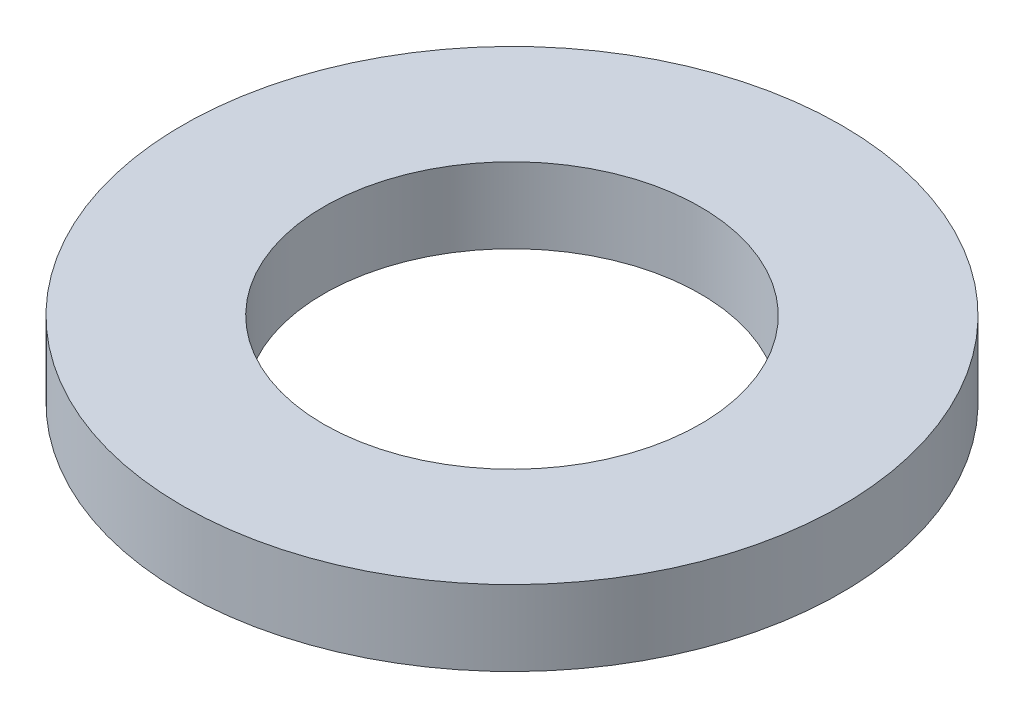
ISO-10303-21;
HEADER;
FILE_DESCRIPTION(('STEP AP214'),'2;1');
FILE_NAME('part.step','',(''),(''),'','','');
FILE_SCHEMA(('AUTOMOTIVE_DESIGN { 1 0 10303 214 1 1 1 1 }'));
ENDSEC;
DATA;
#1=APPLICATION_CONTEXT('core data for automotive mechanical design processes');
#2=APPLICATION_PROTOCOL_DEFINITION('international standard','automotive_design',2000,#1);
#3=PRODUCT_CONTEXT('',#1,'mechanical');
#4=PRODUCT('Part','Part','',(#3));
#5=PRODUCT_RELATED_PRODUCT_CATEGORY('part','',(#4));
#6=PRODUCT_DEFINITION_FORMATION('','',#4);
#7=PRODUCT_DEFINITION_CONTEXT('part definition',#1,'design');
#8=PRODUCT_DEFINITION('design','',#6,#7);
#9=PRODUCT_DEFINITION_SHAPE('','',#8);
#10=(LENGTH_UNIT() NAMED_UNIT(*) SI_UNIT(.MILLI.,.METRE.));
#11=(NAMED_UNIT(*) PLANE_ANGLE_UNIT() SI_UNIT($,.RADIAN.));
#12=(NAMED_UNIT(*) SI_UNIT($,.STERADIAN.) SOLID_ANGLE_UNIT());
#13=UNCERTAINTY_MEASURE_WITH_UNIT(LENGTH_MEASURE(1.E-05),#10,'distance_accuracy_value','');
#14=(GEOMETRIC_REPRESENTATION_CONTEXT(3) GLOBAL_UNCERTAINTY_ASSIGNED_CONTEXT((#13)) GLOBAL_UNIT_ASSIGNED_CONTEXT((#10,
#11,#12)) REPRESENTATION_CONTEXT('',''));
#15=CARTESIAN_POINT('',(0.,0.,0.));
#16=DIRECTION('',(0.,0.,1.));
#17=DIRECTION('',(1.,0.,0.));
#18=AXIS2_PLACEMENT_3D('',#15,#16,#17);
#19=CARTESIAN_POINT('',(0.,4.,0.));
#20=DIRECTION('',(0.,1.,0.));
#21=DIRECTION('',(0.,0.,1.));
#22=AXIS2_PLACEMENT_3D('',#19,#20,#21);
#23=PLANE('',#22);
#24=CARTESIAN_POINT('',(0.,4.,0.));
#25=DIRECTION('',(0.,1.,0.));
#26=DIRECTION('',(0.,0.,1.));
#27=AXIS2_PLACEMENT_3D('',#24,#25,#26);
#28=CIRCLE('',#27,17.5);
#29=CARTESIAN_POINT('',(0.,4.,17.5));
#30=VERTEX_POINT('',#29);
#31=EDGE_CURVE('E10',#30,#30,#28,.T.);
#32=ORIENTED_EDGE('',*,*,#31,.T.);
#33=EDGE_LOOP('',(#32));
#34=FACE_BOUND('',#33,.T.);
#35=CARTESIAN_POINT('',(0.,4.,0.));
#36=DIRECTION('',(0.,1.,0.));
#37=DIRECTION('',(0.,0.,1.));
#38=AXIS2_PLACEMENT_3D('',#35,#36,#37);
#39=CIRCLE('',#38,10.);
#40=CARTESIAN_POINT('',(0.,4.,10.));
#41=VERTEX_POINT('',#40);
#42=EDGE_CURVE('E49',#41,#41,#39,.T.);
#43=ORIENTED_EDGE('',*,*,#42,.F.);
#44=EDGE_LOOP('',(#43));
#45=FACE_BOUND('',#44,.T.);
#46=ADVANCED_FACE('F38',(#34,#45),#23,.T.);
#47=CARTESIAN_POINT('',(0.,0.,0.));
#48=DIRECTION('',(0.,1.,0.));
#49=DIRECTION('',(0.,0.,1.));
#50=AXIS2_PLACEMENT_3D('',#47,#48,#49);
#51=PLANE('',#50);
#52=CARTESIAN_POINT('',(0.,0.,0.));
#53=DIRECTION('',(0.,1.,0.));
#54=DIRECTION('',(0.,0.,1.));
#55=AXIS2_PLACEMENT_3D('',#52,#53,#54);
#56=CIRCLE('',#55,17.5);
#57=CARTESIAN_POINT('',(0.,0.,17.5));
#58=VERTEX_POINT('',#57);
#59=EDGE_CURVE('E42',#58,#58,#56,.T.);
#60=ORIENTED_EDGE('',*,*,#59,.F.);
#61=EDGE_LOOP('',(#60));
#62=FACE_BOUND('',#61,.T.);
#63=CARTESIAN_POINT('',(0.,0.,0.));
#64=DIRECTION('',(0.,1.,0.));
#65=DIRECTION('',(0.,0.,1.));
#66=AXIS2_PLACEMENT_3D('',#63,#64,#65);
#67=CIRCLE('',#66,10.);
#68=CARTESIAN_POINT('',(0.,0.,10.));
#69=VERTEX_POINT('',#68);
#70=EDGE_CURVE('E51',#69,#69,#67,.T.);
#71=ORIENTED_EDGE('',*,*,#70,.T.);
#72=EDGE_LOOP('',(#71));
#73=FACE_BOUND('',#72,.T.);
#74=ADVANCED_FACE('F61',(#62,#73),#51,.F.);
#75=CARTESIAN_POINT('',(0.,4.,0.));
#76=DIRECTION('',(0.,-1.,0.));
#77=DIRECTION('',(0.,0.,-1.));
#78=AXIS2_PLACEMENT_3D('',#75,#76,#77);
#79=CYLINDRICAL_SURFACE('',#78,17.5);
#80=ORIENTED_EDGE('',*,*,#31,.F.);
#81=EDGE_LOOP('',(#80));
#82=FACE_BOUND('',#81,.T.);
#83=ORIENTED_EDGE('',*,*,#59,.T.);
#84=EDGE_LOOP('',(#83));
#85=FACE_BOUND('',#84,.T.);
#86=ADVANCED_FACE('F40',(#82,#85),#79,.T.);
#87=CARTESIAN_POINT('',(0.,4.,0.));
#88=DIRECTION('',(0.,-1.,0.));
#89=DIRECTION('',(0.,0.,-1.));
#90=AXIS2_PLACEMENT_3D('',#87,#88,#89);
#91=CYLINDRICAL_SURFACE('',#90,10.);
#92=ORIENTED_EDGE('',*,*,#42,.T.);
#93=EDGE_LOOP('',(#92));
#94=FACE_BOUND('',#93,.T.);
#95=ORIENTED_EDGE('',*,*,#70,.F.);
#96=EDGE_LOOP('',(#95));
#97=FACE_BOUND('',#96,.T.);
#98=ADVANCED_FACE('F57',(#94,#97),#91,.F.);
#99=CLOSED_SHELL('',(#46,#74,#86,#98));
#100=MANIFOLD_SOLID_BREP('B2',#99);
#101=ADVANCED_BREP_SHAPE_REPRESENTATION('',(#18,#100),#14);
#102=SHAPE_DEFINITION_REPRESENTATION(#9,#101);
ENDSEC;
END-ISO-10303-21;
